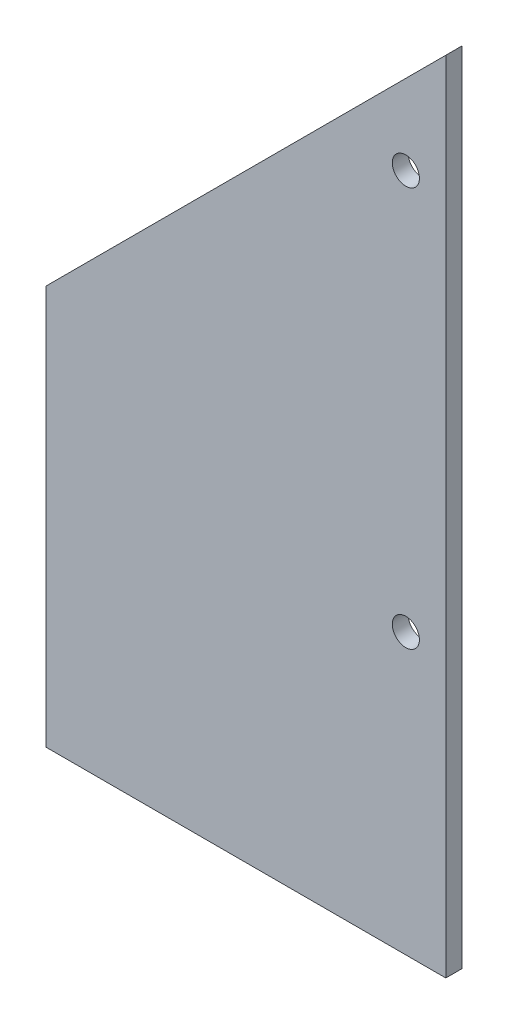
ISO-10303-21;
HEADER;
FILE_DESCRIPTION(('STEP AP214'),'2;1');
FILE_NAME('part.step','',(''),(''),'','','');
FILE_SCHEMA(('AUTOMOTIVE_DESIGN { 1 0 10303 214 1 1 1 1 }'));
ENDSEC;
DATA;
#1=APPLICATION_CONTEXT('core data for automotive mechanical design processes');
#2=APPLICATION_PROTOCOL_DEFINITION('international standard','automotive_design',2000,#1);
#3=PRODUCT_CONTEXT('',#1,'mechanical');
#4=PRODUCT('Part','Part','',(#3));
#5=PRODUCT_RELATED_PRODUCT_CATEGORY('part','',(#4));
#6=PRODUCT_DEFINITION_FORMATION('','',#4);
#7=PRODUCT_DEFINITION_CONTEXT('part definition',#1,'design');
#8=PRODUCT_DEFINITION('design','',#6,#7);
#9=PRODUCT_DEFINITION_SHAPE('','',#8);
#10=(LENGTH_UNIT() NAMED_UNIT(*) SI_UNIT(.MILLI.,.METRE.));
#11=(NAMED_UNIT(*) PLANE_ANGLE_UNIT() SI_UNIT($,.RADIAN.));
#12=(NAMED_UNIT(*) SI_UNIT($,.STERADIAN.) SOLID_ANGLE_UNIT());
#13=UNCERTAINTY_MEASURE_WITH_UNIT(LENGTH_MEASURE(1.E-05),#10,'distance_accuracy_value','');
#14=(GEOMETRIC_REPRESENTATION_CONTEXT(3) GLOBAL_UNCERTAINTY_ASSIGNED_CONTEXT((#13)) GLOBAL_UNIT_ASSIGNED_CONTEXT((#10,
#11,#12)) REPRESENTATION_CONTEXT('',''));
#15=CARTESIAN_POINT('',(0.,0.,0.));
#16=DIRECTION('',(0.,0.,1.));
#17=DIRECTION('',(1.,0.,0.));
#18=AXIS2_PLACEMENT_3D('',#15,#16,#17);
#19=CARTESIAN_POINT('',(-49.9999999999992,-50.0000000000003,2.));
#20=DIRECTION('',(0.707106781186555,-0.70710678118654,0.));
#21=DIRECTION('',(0.70710678118654,0.707106781186555,0.));
#22=AXIS2_PLACEMENT_3D('',#19,#20,#21);
#23=PLANE('',#22);
#24=DIRECTION('',(-0.70710678118654,-0.707106781186555,0.));
#25=VECTOR('',#24,1.);
#26=CARTESIAN_POINT('',(-49.9999999999992,-50.0000000000003,0.));
#27=LINE('',#26,#25);
#28=CARTESIAN_POINT('',(0.,0.,0.));
#29=VERTEX_POINT('',#28);
#30=CARTESIAN_POINT('',(-49.9999999999992,-50.0000000000003,0.));
#31=VERTEX_POINT('',#30);
#32=EDGE_CURVE('E102',#29,#31,#27,.T.);
#33=ORIENTED_EDGE('',*,*,#32,.T.);
#34=DIRECTION('',(0.,0.,-1.));
#35=VECTOR('',#34,1.);
#36=CARTESIAN_POINT('',(-49.9999999999992,-50.0000000000003,2.));
#37=LINE('',#36,#35);
#38=CARTESIAN_POINT('',(-49.9999999999992,-50.0000000000003,2.));
#39=VERTEX_POINT('',#38);
#40=EDGE_CURVE('E11',#39,#31,#37,.T.);
#41=ORIENTED_EDGE('',*,*,#40,.F.);
#42=DIRECTION('',(-0.70710678118654,-0.707106781186555,0.));
#43=VECTOR('',#42,1.);
#44=CARTESIAN_POINT('',(-49.9999999999992,-50.0000000000003,2.));
#45=LINE('',#44,#43);
#46=CARTESIAN_POINT('',(0.,0.,2.));
#47=VERTEX_POINT('',#46);
#48=EDGE_CURVE('E90',#47,#39,#45,.T.);
#49=ORIENTED_EDGE('',*,*,#48,.F.);
#50=DIRECTION('',(0.,0.,-1.));
#51=VECTOR('',#50,1.);
#52=CARTESIAN_POINT('',(0.,0.,2.));
#53=LINE('',#52,#51);
#54=EDGE_CURVE('E98',#47,#29,#53,.T.);
#55=ORIENTED_EDGE('',*,*,#54,.T.);
#56=EDGE_LOOP('',(#33,#41,#49,#55));
#57=FACE_BOUND('',#56,.T.);
#58=ADVANCED_FACE('F39',(#57),#23,.F.);
#59=CARTESIAN_POINT('',(-49.9999999999995,-100.,2.));
#60=DIRECTION('',(1.,0.,0.));
#61=DIRECTION('',(0.,1.,0.));
#62=AXIS2_PLACEMENT_3D('',#59,#60,#61);
#63=PLANE('',#62);
#64=DIRECTION('',(0.,-1.,0.));
#65=VECTOR('',#64,1.);
#66=CARTESIAN_POINT('',(-49.9999999999995,-100.,0.));
#67=LINE('',#66,#65);
#68=CARTESIAN_POINT('',(-49.9999999999995,-100.,0.));
#69=VERTEX_POINT('',#68);
#70=EDGE_CURVE('E94',#31,#69,#67,.T.);
#71=ORIENTED_EDGE('',*,*,#70,.T.);
#72=DIRECTION('',(0.,0.,-1.));
#73=VECTOR('',#72,1.);
#74=CARTESIAN_POINT('',(-49.9999999999995,-100.,2.));
#75=LINE('',#74,#73);
#76=CARTESIAN_POINT('',(-49.9999999999995,-100.,2.));
#77=VERTEX_POINT('',#76);
#78=EDGE_CURVE('E47',#77,#69,#75,.T.);
#79=ORIENTED_EDGE('',*,*,#78,.F.);
#80=DIRECTION('',(0.,-1.,0.));
#81=VECTOR('',#80,1.);
#82=CARTESIAN_POINT('',(-49.9999999999995,-100.,2.));
#83=LINE('',#82,#81);
#84=EDGE_CURVE('E85',#39,#77,#83,.T.);
#85=ORIENTED_EDGE('',*,*,#84,.F.);
#86=ORIENTED_EDGE('',*,*,#40,.T.);
#87=EDGE_LOOP('',(#71,#79,#85,#86));
#88=FACE_BOUND('',#87,.T.);
#89=ADVANCED_FACE('F93',(#88),#63,.F.);
#90=CARTESIAN_POINT('',(0.,-100.,2.));
#91=DIRECTION('',(0.,1.,0.));
#92=DIRECTION('',(-1.,0.,0.));
#93=AXIS2_PLACEMENT_3D('',#90,#91,#92);
#94=PLANE('',#93);
#95=DIRECTION('',(1.,0.,0.));
#96=VECTOR('',#95,1.);
#97=CARTESIAN_POINT('',(0.,-100.,0.));
#98=LINE('',#97,#96);
#99=CARTESIAN_POINT('',(0.,-100.,0.));
#100=VERTEX_POINT('',#99);
#101=EDGE_CURVE('E72',#69,#100,#98,.T.);
#102=ORIENTED_EDGE('',*,*,#101,.T.);
#103=DIRECTION('',(0.,0.,-1.));
#104=VECTOR('',#103,1.);
#105=CARTESIAN_POINT('',(0.,-100.,2.));
#106=LINE('',#105,#104);
#107=CARTESIAN_POINT('',(0.,-100.,2.));
#108=VERTEX_POINT('',#107);
#109=EDGE_CURVE('E95',#108,#100,#106,.T.);
#110=ORIENTED_EDGE('',*,*,#109,.F.);
#111=DIRECTION('',(1.,0.,0.));
#112=VECTOR('',#111,1.);
#113=CARTESIAN_POINT('',(0.,-100.,2.));
#114=LINE('',#113,#112);
#115=EDGE_CURVE('E88',#77,#108,#114,.T.);
#116=ORIENTED_EDGE('',*,*,#115,.F.);
#117=ORIENTED_EDGE('',*,*,#78,.T.);
#118=EDGE_LOOP('',(#102,#110,#116,#117));
#119=FACE_BOUND('',#118,.T.);
#120=ADVANCED_FACE('F96',(#119),#94,.F.);
#121=CARTESIAN_POINT('',(0.,0.,2.));
#122=DIRECTION('',(-1.,0.,0.));
#123=DIRECTION('',(0.,0.,1.));
#124=AXIS2_PLACEMENT_3D('',#121,#122,#123);
#125=PLANE('',#124);
#126=DIRECTION('',(0.,1.,0.));
#127=VECTOR('',#126,1.);
#128=CARTESIAN_POINT('',(0.,0.,0.));
#129=LINE('',#128,#127);
#130=EDGE_CURVE('E78',#100,#29,#129,.T.);
#131=ORIENTED_EDGE('',*,*,#130,.T.);
#132=ORIENTED_EDGE('',*,*,#54,.F.);
#133=DIRECTION('',(0.,1.,0.));
#134=VECTOR('',#133,1.);
#135=CARTESIAN_POINT('',(0.,0.,2.));
#136=LINE('',#135,#134);
#137=EDGE_CURVE('E55',#108,#47,#136,.T.);
#138=ORIENTED_EDGE('',*,*,#137,.F.);
#139=ORIENTED_EDGE('',*,*,#109,.T.);
#140=EDGE_LOOP('',(#131,#132,#138,#139));
#141=FACE_BOUND('',#140,.T.);
#142=ADVANCED_FACE('F110',(#141),#125,.F.);
#143=CARTESIAN_POINT('',(0.,0.,2.));
#144=DIRECTION('',(0.,0.,-1.));
#145=DIRECTION('',(-1.,0.,0.));
#146=AXIS2_PLACEMENT_3D('',#143,#144,#145);
#147=PLANE('',#146);
#148=CARTESIAN_POINT('',(-5.,-15.,2.));
#149=DIRECTION('',(0.,0.,1.));
#150=DIRECTION('',(1.,0.,0.));
#151=AXIS2_PLACEMENT_3D('',#148,#149,#150);
#152=CIRCLE('',#151,1.7);
#153=CARTESIAN_POINT('',(-3.3,-15.,2.));
#154=VERTEX_POINT('',#153);
#155=EDGE_CURVE('E122',#154,#154,#152,.T.);
#156=ORIENTED_EDGE('',*,*,#155,.F.);
#157=EDGE_LOOP('',(#156));
#158=FACE_BOUND('',#157,.T.);
#159=CARTESIAN_POINT('',(-4.99999999999999,-65.,2.));
#160=DIRECTION('',(0.,0.,1.));
#161=DIRECTION('',(1.,0.,0.));
#162=AXIS2_PLACEMENT_3D('',#159,#160,#161);
#163=CIRCLE('',#162,1.70000000000001);
#164=CARTESIAN_POINT('',(-3.29999999999998,-65.,2.));
#165=VERTEX_POINT('',#164);
#166=EDGE_CURVE('E119',#165,#165,#163,.T.);
#167=ORIENTED_EDGE('',*,*,#166,.F.);
#168=EDGE_LOOP('',(#167));
#169=FACE_BOUND('',#168,.T.);
#170=ORIENTED_EDGE('',*,*,#48,.T.);
#171=ORIENTED_EDGE('',*,*,#84,.T.);
#172=ORIENTED_EDGE('',*,*,#115,.T.);
#173=ORIENTED_EDGE('',*,*,#137,.T.);
#174=EDGE_LOOP('',(#170,#171,#172,#173));
#175=FACE_BOUND('',#174,.T.);
#176=ADVANCED_FACE('F86',(#158,#169,#175),#147,.F.);
#177=CARTESIAN_POINT('',(0.,0.,0.));
#178=DIRECTION('',(0.,0.,-1.));
#179=DIRECTION('',(-1.,0.,0.));
#180=AXIS2_PLACEMENT_3D('',#177,#178,#179);
#181=PLANE('',#180);
#182=CARTESIAN_POINT('',(-5.,-15.,0.));
#183=DIRECTION('',(0.,0.,1.));
#184=DIRECTION('',(1.,0.,0.));
#185=AXIS2_PLACEMENT_3D('',#182,#183,#184);
#186=CIRCLE('',#185,1.7);
#187=CARTESIAN_POINT('',(-3.3,-15.,0.));
#188=VERTEX_POINT('',#187);
#189=EDGE_CURVE('E105',#188,#188,#186,.T.);
#190=ORIENTED_EDGE('',*,*,#189,.T.);
#191=EDGE_LOOP('',(#190));
#192=FACE_BOUND('',#191,.T.);
#193=CARTESIAN_POINT('',(-4.99999999999999,-65.,0.));
#194=DIRECTION('',(0.,0.,1.));
#195=DIRECTION('',(1.,0.,0.));
#196=AXIS2_PLACEMENT_3D('',#193,#194,#195);
#197=CIRCLE('',#196,1.70000000000001);
#198=CARTESIAN_POINT('',(-3.29999999999998,-65.,0.));
#199=VERTEX_POINT('',#198);
#200=EDGE_CURVE('E116',#199,#199,#197,.T.);
#201=ORIENTED_EDGE('',*,*,#200,.T.);
#202=EDGE_LOOP('',(#201));
#203=FACE_BOUND('',#202,.T.);
#204=ORIENTED_EDGE('',*,*,#32,.F.);
#205=ORIENTED_EDGE('',*,*,#130,.F.);
#206=ORIENTED_EDGE('',*,*,#101,.F.);
#207=ORIENTED_EDGE('',*,*,#70,.F.);
#208=EDGE_LOOP('',(#204,#205,#206,#207));
#209=FACE_BOUND('',#208,.T.);
#210=ADVANCED_FACE('F113',(#192,#203,#209),#181,.T.);
#211=CARTESIAN_POINT('',(-4.99999999999999,-65.,0.));
#212=DIRECTION('',(0.,0.,1.));
#213=DIRECTION('',(1.,0.,0.));
#214=AXIS2_PLACEMENT_3D('',#211,#212,#213);
#215=CYLINDRICAL_SURFACE('',#214,1.70000000000001);
#216=ORIENTED_EDGE('',*,*,#200,.F.);
#217=EDGE_LOOP('',(#216));
#218=FACE_BOUND('',#217,.T.);
#219=ORIENTED_EDGE('',*,*,#166,.T.);
#220=EDGE_LOOP('',(#219));
#221=FACE_BOUND('',#220,.T.);
#222=ADVANCED_FACE('F133',(#218,#221),#215,.F.);
#223=CARTESIAN_POINT('',(-5.,-15.,0.));
#224=DIRECTION('',(0.,0.,1.));
#225=DIRECTION('',(1.,0.,0.));
#226=AXIS2_PLACEMENT_3D('',#223,#224,#225);
#227=CYLINDRICAL_SURFACE('',#226,1.7);
#228=ORIENTED_EDGE('',*,*,#189,.F.);
#229=EDGE_LOOP('',(#228));
#230=FACE_BOUND('',#229,.T.);
#231=ORIENTED_EDGE('',*,*,#155,.T.);
#232=EDGE_LOOP('',(#231));
#233=FACE_BOUND('',#232,.T.);
#234=ADVANCED_FACE('F130',(#230,#233),#227,.F.);
#235=CLOSED_SHELL('',(#58,#89,#120,#142,#176,#210,#222,#234));
#236=MANIFOLD_SOLID_BREP('B2',#235);
#237=ADVANCED_BREP_SHAPE_REPRESENTATION('',(#18,#236),#14);
#238=SHAPE_DEFINITION_REPRESENTATION(#9,#237);
ENDSEC;
END-ISO-10303-21;
